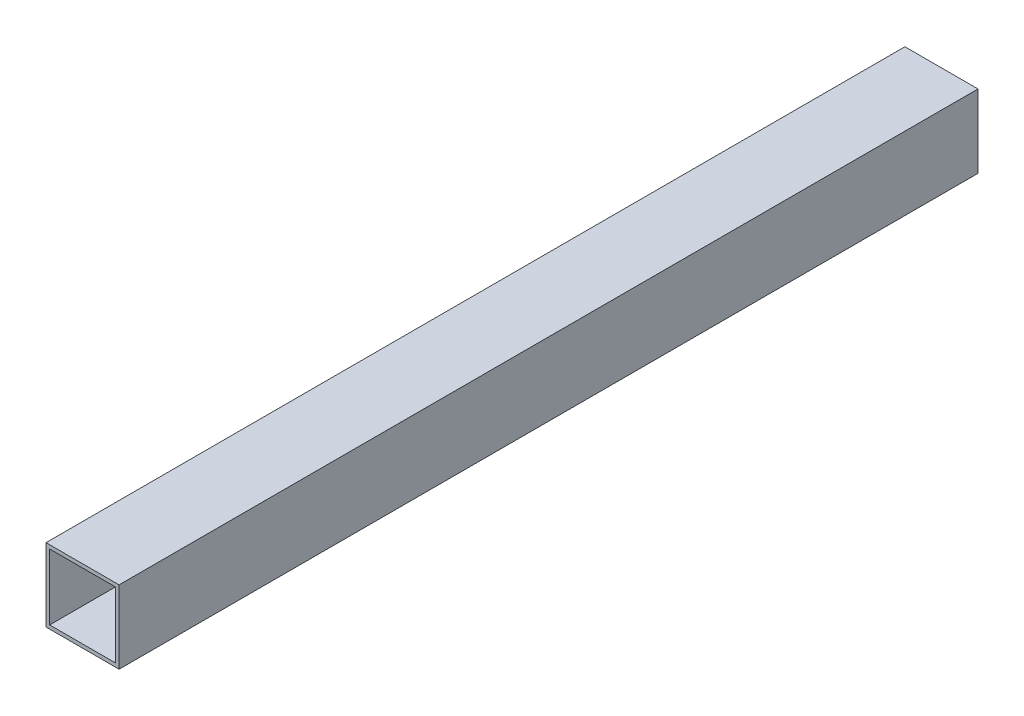
ISO-10303-21;
HEADER;
FILE_DESCRIPTION(('STEP AP214'),'2;1');
FILE_NAME('part.step','',(''),(''),'','','');
FILE_SCHEMA(('AUTOMOTIVE_DESIGN { 1 0 10303 214 1 1 1 1 }'));
ENDSEC;
DATA;
#1=APPLICATION_CONTEXT('core data for automotive mechanical design processes');
#2=APPLICATION_PROTOCOL_DEFINITION('international standard','automotive_design',2000,#1);
#3=PRODUCT_CONTEXT('',#1,'mechanical');
#4=PRODUCT('Part','Part','',(#3));
#5=PRODUCT_RELATED_PRODUCT_CATEGORY('part','',(#4));
#6=PRODUCT_DEFINITION_FORMATION('','',#4);
#7=PRODUCT_DEFINITION_CONTEXT('part definition',#1,'design');
#8=PRODUCT_DEFINITION('design','',#6,#7);
#9=PRODUCT_DEFINITION_SHAPE('','',#8);
#10=(LENGTH_UNIT() NAMED_UNIT(*) SI_UNIT(.MILLI.,.METRE.));
#11=(NAMED_UNIT(*) PLANE_ANGLE_UNIT() SI_UNIT($,.RADIAN.));
#12=(NAMED_UNIT(*) SI_UNIT($,.STERADIAN.) SOLID_ANGLE_UNIT());
#13=UNCERTAINTY_MEASURE_WITH_UNIT(LENGTH_MEASURE(1.E-05),#10,'distance_accuracy_value','');
#14=(GEOMETRIC_REPRESENTATION_CONTEXT(3) GLOBAL_UNCERTAINTY_ASSIGNED_CONTEXT((#13)) GLOBAL_UNIT_ASSIGNED_CONTEXT((#10,
#11,#12)) REPRESENTATION_CONTEXT('',''));
#15=CARTESIAN_POINT('',(0.,0.,0.));
#16=DIRECTION('',(0.,0.,1.));
#17=DIRECTION('',(1.,0.,0.));
#18=AXIS2_PLACEMENT_3D('',#15,#16,#17);
#19=CARTESIAN_POINT('',(-580.000000000005,-20.,470.));
#20=DIRECTION('',(0.,0.,1.));
#21=DIRECTION('',(-1.,0.,0.));
#22=AXIS2_PLACEMENT_3D('',#19,#20,#21);
#23=PLANE('',#22);
#24=DIRECTION('',(0.,-1.,0.));
#25=VECTOR('',#24,1.);
#26=CARTESIAN_POINT('',(-580.000000000005,-20.,470.));
#27=LINE('',#26,#25);
#28=CARTESIAN_POINT('',(-580.000000000005,20.,470.));
#29=VERTEX_POINT('',#28);
#30=CARTESIAN_POINT('',(-580.000000000005,-20.,470.));
#31=VERTEX_POINT('',#30);
#32=EDGE_CURVE('E131',#29,#31,#27,.T.);
#33=ORIENTED_EDGE('',*,*,#32,.F.);
#34=DIRECTION('',(1.,0.,0.));
#35=VECTOR('',#34,1.);
#36=CARTESIAN_POINT('',(-620.000000000005,20.,470.));
#37=LINE('',#36,#35);
#38=CARTESIAN_POINT('',(-620.000000000005,20.,470.));
#39=VERTEX_POINT('',#38);
#40=EDGE_CURVE('E141',#39,#29,#37,.T.);
#41=ORIENTED_EDGE('',*,*,#40,.F.);
#42=DIRECTION('',(0.,1.,0.));
#43=VECTOR('',#42,1.);
#44=CARTESIAN_POINT('',(-620.000000000005,-20.,470.));
#45=LINE('',#44,#43);
#46=CARTESIAN_POINT('',(-620.000000000005,-20.,470.));
#47=VERTEX_POINT('',#46);
#48=EDGE_CURVE('E138',#47,#39,#45,.T.);
#49=ORIENTED_EDGE('',*,*,#48,.F.);
#50=DIRECTION('',(-1.,0.,0.));
#51=VECTOR('',#50,1.);
#52=CARTESIAN_POINT('',(-620.000000000005,-20.,470.));
#53=LINE('',#52,#51);
#54=EDGE_CURVE('E134',#31,#47,#53,.T.);
#55=ORIENTED_EDGE('',*,*,#54,.F.);
#56=EDGE_LOOP('',(#33,#41,#49,#55));
#57=FACE_BOUND('',#56,.T.);
#58=DIRECTION('',(-1.,0.,0.));
#59=VECTOR('',#58,1.);
#60=CARTESIAN_POINT('',(-620.000000000005,-18.,470.));
#61=LINE('',#60,#59);
#62=CARTESIAN_POINT('',(-582.000000000005,-18.,470.));
#63=VERTEX_POINT('',#62);
#64=CARTESIAN_POINT('',(-618.000000000005,-18.,470.));
#65=VERTEX_POINT('',#64);
#66=EDGE_CURVE('E112',#63,#65,#61,.T.);
#67=ORIENTED_EDGE('',*,*,#66,.T.);
#68=DIRECTION('',(0.,1.,0.));
#69=VECTOR('',#68,1.);
#70=CARTESIAN_POINT('',(-618.000000000005,-20.,470.));
#71=LINE('',#70,#69);
#72=CARTESIAN_POINT('',(-618.000000000005,18.,470.));
#73=VERTEX_POINT('',#72);
#74=EDGE_CURVE('E117',#65,#73,#71,.T.);
#75=ORIENTED_EDGE('',*,*,#74,.T.);
#76=DIRECTION('',(1.,0.,0.));
#77=VECTOR('',#76,1.);
#78=CARTESIAN_POINT('',(-620.000000000005,18.,470.));
#79=LINE('',#78,#77);
#80=CARTESIAN_POINT('',(-582.000000000005,18.,470.));
#81=VERTEX_POINT('',#80);
#82=EDGE_CURVE('E113',#73,#81,#79,.T.);
#83=ORIENTED_EDGE('',*,*,#82,.T.);
#84=DIRECTION('',(0.,-1.,0.));
#85=VECTOR('',#84,1.);
#86=CARTESIAN_POINT('',(-582.000000000005,-20.,470.));
#87=LINE('',#86,#85);
#88=EDGE_CURVE('E98',#81,#63,#87,.T.);
#89=ORIENTED_EDGE('',*,*,#88,.T.);
#90=EDGE_LOOP('',(#67,#75,#83,#89));
#91=FACE_BOUND('',#90,.T.);
#92=ADVANCED_FACE('F32',(#57,#91),#23,.T.);
#93=CARTESIAN_POINT('',(-580.000000000005,-20.,0.));
#94=DIRECTION('',(0.,0.,1.));
#95=DIRECTION('',(-1.,0.,0.));
#96=AXIS2_PLACEMENT_3D('',#93,#94,#95);
#97=PLANE('',#96);
#98=DIRECTION('',(0.,-1.,0.));
#99=VECTOR('',#98,1.);
#100=CARTESIAN_POINT('',(-580.000000000005,-20.,0.));
#101=LINE('',#100,#99);
#102=CARTESIAN_POINT('',(-580.000000000005,20.,0.));
#103=VERTEX_POINT('',#102);
#104=CARTESIAN_POINT('',(-580.000000000005,-20.,0.));
#105=VERTEX_POINT('',#104);
#106=EDGE_CURVE('E106',#103,#105,#101,.T.);
#107=ORIENTED_EDGE('',*,*,#106,.T.);
#108=DIRECTION('',(-1.,0.,0.));
#109=VECTOR('',#108,1.);
#110=CARTESIAN_POINT('',(-620.000000000005,-20.,0.));
#111=LINE('',#110,#109);
#112=CARTESIAN_POINT('',(-620.000000000005,-20.,0.));
#113=VERTEX_POINT('',#112);
#114=EDGE_CURVE('E147',#105,#113,#111,.T.);
#115=ORIENTED_EDGE('',*,*,#114,.T.);
#116=DIRECTION('',(0.,1.,0.));
#117=VECTOR('',#116,1.);
#118=CARTESIAN_POINT('',(-620.000000000005,-20.,0.));
#119=LINE('',#118,#117);
#120=CARTESIAN_POINT('',(-620.000000000005,20.,0.));
#121=VERTEX_POINT('',#120);
#122=EDGE_CURVE('E150',#113,#121,#119,.T.);
#123=ORIENTED_EDGE('',*,*,#122,.T.);
#124=DIRECTION('',(1.,0.,0.));
#125=VECTOR('',#124,1.);
#126=CARTESIAN_POINT('',(-620.000000000005,20.,0.));
#127=LINE('',#126,#125);
#128=EDGE_CURVE('E135',#121,#103,#127,.T.);
#129=ORIENTED_EDGE('',*,*,#128,.T.);
#130=EDGE_LOOP('',(#107,#115,#123,#129));
#131=FACE_BOUND('',#130,.T.);
#132=DIRECTION('',(0.,-1.,0.));
#133=VECTOR('',#132,1.);
#134=CARTESIAN_POINT('',(-582.000000000005,-20.,0.));
#135=LINE('',#134,#133);
#136=CARTESIAN_POINT('',(-582.000000000005,18.,0.));
#137=VERTEX_POINT('',#136);
#138=CARTESIAN_POINT('',(-582.000000000005,-18.,0.));
#139=VERTEX_POINT('',#138);
#140=EDGE_CURVE('E101',#137,#139,#135,.T.);
#141=ORIENTED_EDGE('',*,*,#140,.F.);
#142=DIRECTION('',(1.,0.,0.));
#143=VECTOR('',#142,1.);
#144=CARTESIAN_POINT('',(-620.000000000005,18.,0.));
#145=LINE('',#144,#143);
#146=CARTESIAN_POINT('',(-618.000000000005,18.,0.));
#147=VERTEX_POINT('',#146);
#148=EDGE_CURVE('E114',#147,#137,#145,.T.);
#149=ORIENTED_EDGE('',*,*,#148,.F.);
#150=DIRECTION('',(0.,1.,0.));
#151=VECTOR('',#150,1.);
#152=CARTESIAN_POINT('',(-618.000000000005,-20.,0.));
#153=LINE('',#152,#151);
#154=CARTESIAN_POINT('',(-618.000000000005,-18.,0.));
#155=VERTEX_POINT('',#154);
#156=EDGE_CURVE('E125',#155,#147,#153,.T.);
#157=ORIENTED_EDGE('',*,*,#156,.F.);
#158=DIRECTION('',(-1.,0.,0.));
#159=VECTOR('',#158,1.);
#160=CARTESIAN_POINT('',(-620.000000000005,-18.,0.));
#161=LINE('',#160,#159);
#162=EDGE_CURVE('E123',#139,#155,#161,.T.);
#163=ORIENTED_EDGE('',*,*,#162,.F.);
#164=EDGE_LOOP('',(#141,#149,#157,#163));
#165=FACE_BOUND('',#164,.T.);
#166=ADVANCED_FACE('F167',(#131,#165),#97,.F.);
#167=CARTESIAN_POINT('',(-580.000000000005,-20.,470.));
#168=DIRECTION('',(-1.,0.,0.));
#169=DIRECTION('',(0.,0.,-1.));
#170=AXIS2_PLACEMENT_3D('',#167,#168,#169);
#171=PLANE('',#170);
#172=ORIENTED_EDGE('',*,*,#106,.F.);
#173=DIRECTION('',(0.,0.,-1.));
#174=VECTOR('',#173,1.);
#175=CARTESIAN_POINT('',(-580.000000000005,20.,470.));
#176=LINE('',#175,#174);
#177=EDGE_CURVE('E144',#29,#103,#176,.T.);
#178=ORIENTED_EDGE('',*,*,#177,.F.);
#179=ORIENTED_EDGE('',*,*,#32,.T.);
#180=DIRECTION('',(0.,0.,-1.));
#181=VECTOR('',#180,1.);
#182=CARTESIAN_POINT('',(-580.000000000005,-20.,470.));
#183=LINE('',#182,#181);
#184=EDGE_CURVE('E11',#31,#105,#183,.T.);
#185=ORIENTED_EDGE('',*,*,#184,.T.);
#186=EDGE_LOOP('',(#172,#178,#179,#185));
#187=FACE_BOUND('',#186,.T.);
#188=ADVANCED_FACE('F34',(#187),#171,.F.);
#189=CARTESIAN_POINT('',(-620.000000000005,-20.,470.));
#190=DIRECTION('',(0.,1.,0.));
#191=DIRECTION('',(1.,0.,0.));
#192=AXIS2_PLACEMENT_3D('',#189,#190,#191);
#193=PLANE('',#192);
#194=ORIENTED_EDGE('',*,*,#114,.F.);
#195=ORIENTED_EDGE('',*,*,#184,.F.);
#196=ORIENTED_EDGE('',*,*,#54,.T.);
#197=DIRECTION('',(0.,0.,-1.));
#198=VECTOR('',#197,1.);
#199=CARTESIAN_POINT('',(-620.000000000005,-20.,470.));
#200=LINE('',#199,#198);
#201=EDGE_CURVE('E40',#47,#113,#200,.T.);
#202=ORIENTED_EDGE('',*,*,#201,.T.);
#203=EDGE_LOOP('',(#194,#195,#196,#202));
#204=FACE_BOUND('',#203,.T.);
#205=ADVANCED_FACE('F160',(#204),#193,.F.);
#206=CARTESIAN_POINT('',(-620.000000000005,-20.,470.));
#207=DIRECTION('',(1.,0.,0.));
#208=DIRECTION('',(0.,0.,1.));
#209=AXIS2_PLACEMENT_3D('',#206,#207,#208);
#210=PLANE('',#209);
#211=ORIENTED_EDGE('',*,*,#122,.F.);
#212=ORIENTED_EDGE('',*,*,#201,.F.);
#213=ORIENTED_EDGE('',*,*,#48,.T.);
#214=DIRECTION('',(0.,0.,-1.));
#215=VECTOR('',#214,1.);
#216=CARTESIAN_POINT('',(-620.000000000005,20.,470.));
#217=LINE('',#216,#215);
#218=EDGE_CURVE('E156',#39,#121,#217,.T.);
#219=ORIENTED_EDGE('',*,*,#218,.T.);
#220=EDGE_LOOP('',(#211,#212,#213,#219));
#221=FACE_BOUND('',#220,.T.);
#222=ADVANCED_FACE('F164',(#221),#210,.F.);
#223=CARTESIAN_POINT('',(-620.000000000005,20.,470.));
#224=DIRECTION('',(0.,-1.,0.));
#225=DIRECTION('',(-1.,0.,0.));
#226=AXIS2_PLACEMENT_3D('',#223,#224,#225);
#227=PLANE('',#226);
#228=ORIENTED_EDGE('',*,*,#128,.F.);
#229=ORIENTED_EDGE('',*,*,#218,.F.);
#230=ORIENTED_EDGE('',*,*,#40,.T.);
#231=ORIENTED_EDGE('',*,*,#177,.T.);
#232=EDGE_LOOP('',(#228,#229,#230,#231));
#233=FACE_BOUND('',#232,.T.);
#234=ADVANCED_FACE('F175',(#233),#227,.F.);
#235=CARTESIAN_POINT('',(-582.000000000005,-20.,470.));
#236=DIRECTION('',(-1.,0.,0.));
#237=DIRECTION('',(0.,0.,-1.));
#238=AXIS2_PLACEMENT_3D('',#235,#236,#237);
#239=PLANE('',#238);
#240=ORIENTED_EDGE('',*,*,#140,.T.);
#241=DIRECTION('',(0.,0.,-1.));
#242=VECTOR('',#241,1.);
#243=CARTESIAN_POINT('',(-582.000000000005,-18.,470.));
#244=LINE('',#243,#242);
#245=EDGE_CURVE('E95',#63,#139,#244,.T.);
#246=ORIENTED_EDGE('',*,*,#245,.F.);
#247=ORIENTED_EDGE('',*,*,#88,.F.);
#248=DIRECTION('',(0.,0.,-1.));
#249=VECTOR('',#248,1.);
#250=CARTESIAN_POINT('',(-582.000000000005,18.,470.));
#251=LINE('',#250,#249);
#252=EDGE_CURVE('E55',#81,#137,#251,.T.);
#253=ORIENTED_EDGE('',*,*,#252,.T.);
#254=EDGE_LOOP('',(#240,#246,#247,#253));
#255=FACE_BOUND('',#254,.T.);
#256=ADVANCED_FACE('F97',(#255),#239,.T.);
#257=CARTESIAN_POINT('',(-620.000000000005,-18.,470.));
#258=DIRECTION('',(0.,1.,0.));
#259=DIRECTION('',(1.,0.,0.));
#260=AXIS2_PLACEMENT_3D('',#257,#258,#259);
#261=PLANE('',#260);
#262=ORIENTED_EDGE('',*,*,#162,.T.);
#263=DIRECTION('',(0.,0.,-1.));
#264=VECTOR('',#263,1.);
#265=CARTESIAN_POINT('',(-618.000000000005,-18.,470.));
#266=LINE('',#265,#264);
#267=EDGE_CURVE('E107',#65,#155,#266,.T.);
#268=ORIENTED_EDGE('',*,*,#267,.F.);
#269=ORIENTED_EDGE('',*,*,#66,.F.);
#270=ORIENTED_EDGE('',*,*,#245,.T.);
#271=EDGE_LOOP('',(#262,#268,#269,#270));
#272=FACE_BOUND('',#271,.T.);
#273=ADVANCED_FACE('F116',(#272),#261,.T.);
#274=CARTESIAN_POINT('',(-618.000000000005,-20.,470.));
#275=DIRECTION('',(1.,0.,0.));
#276=DIRECTION('',(0.,0.,1.));
#277=AXIS2_PLACEMENT_3D('',#274,#275,#276);
#278=PLANE('',#277);
#279=ORIENTED_EDGE('',*,*,#156,.T.);
#280=DIRECTION('',(0.,0.,-1.));
#281=VECTOR('',#280,1.);
#282=CARTESIAN_POINT('',(-618.000000000005,18.,470.));
#283=LINE('',#282,#281);
#284=EDGE_CURVE('E47',#73,#147,#283,.T.);
#285=ORIENTED_EDGE('',*,*,#284,.F.);
#286=ORIENTED_EDGE('',*,*,#74,.F.);
#287=ORIENTED_EDGE('',*,*,#267,.T.);
#288=EDGE_LOOP('',(#279,#285,#286,#287));
#289=FACE_BOUND('',#288,.T.);
#290=ADVANCED_FACE('F193',(#289),#278,.T.);
#291=CARTESIAN_POINT('',(-620.000000000005,18.,470.));
#292=DIRECTION('',(0.,-1.,0.));
#293=DIRECTION('',(-1.,0.,0.));
#294=AXIS2_PLACEMENT_3D('',#291,#292,#293);
#295=PLANE('',#294);
#296=ORIENTED_EDGE('',*,*,#148,.T.);
#297=ORIENTED_EDGE('',*,*,#252,.F.);
#298=ORIENTED_EDGE('',*,*,#82,.F.);
#299=ORIENTED_EDGE('',*,*,#284,.T.);
#300=EDGE_LOOP('',(#296,#297,#298,#299));
#301=FACE_BOUND('',#300,.T.);
#302=ADVANCED_FACE('F196',(#301),#295,.T.);
#303=CLOSED_SHELL('',(#92,#166,#188,#205,#222,#234,#256,#273,#290,#302));
#304=MANIFOLD_SOLID_BREP('B2',#303);
#305=ADVANCED_BREP_SHAPE_REPRESENTATION('',(#18,#304),#14);
#306=SHAPE_DEFINITION_REPRESENTATION(#9,#305);
ENDSEC;
END-ISO-10303-21;
